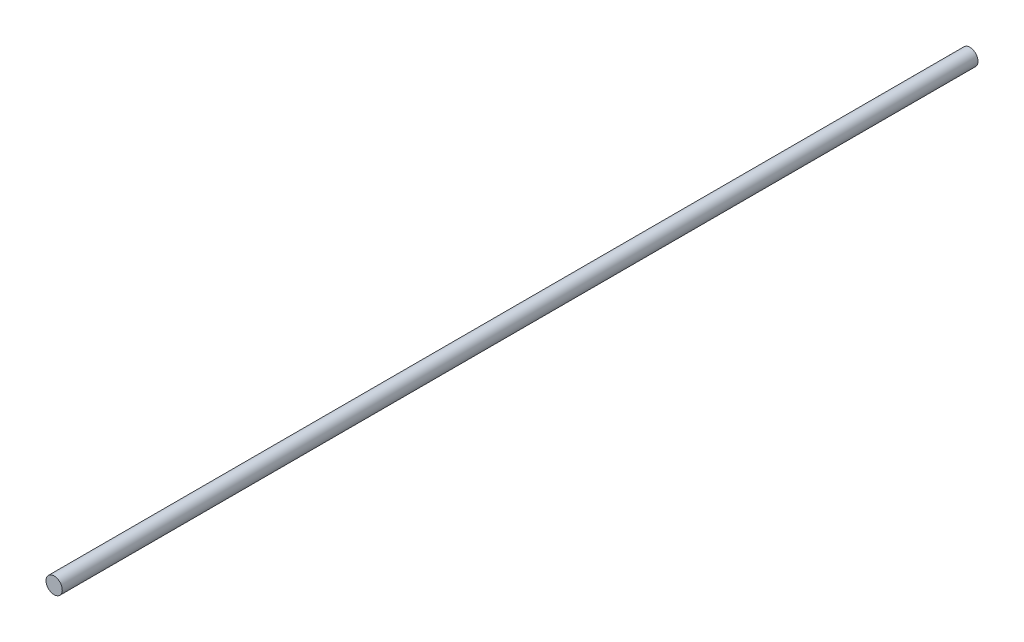
ISO-10303-21;
HEADER;
FILE_DESCRIPTION(('STEP AP214'),'2;1');
FILE_NAME('part.step','',(''),(''),'','','');
FILE_SCHEMA(('AUTOMOTIVE_DESIGN { 1 0 10303 214 1 1 1 1 }'));
ENDSEC;
DATA;
#1=APPLICATION_CONTEXT('core data for automotive mechanical design processes');
#2=APPLICATION_PROTOCOL_DEFINITION('international standard','automotive_design',2000,#1);
#3=PRODUCT_CONTEXT('',#1,'mechanical');
#4=PRODUCT('Part','Part','',(#3));
#5=PRODUCT_RELATED_PRODUCT_CATEGORY('part','',(#4));
#6=PRODUCT_DEFINITION_FORMATION('','',#4);
#7=PRODUCT_DEFINITION_CONTEXT('part definition',#1,'design');
#8=PRODUCT_DEFINITION('design','',#6,#7);
#9=PRODUCT_DEFINITION_SHAPE('','',#8);
#10=(LENGTH_UNIT() NAMED_UNIT(*) SI_UNIT(.MILLI.,.METRE.));
#11=(NAMED_UNIT(*) PLANE_ANGLE_UNIT() SI_UNIT($,.RADIAN.));
#12=(NAMED_UNIT(*) SI_UNIT($,.STERADIAN.) SOLID_ANGLE_UNIT());
#13=UNCERTAINTY_MEASURE_WITH_UNIT(LENGTH_MEASURE(1.E-05),#10,'distance_accuracy_value','');
#14=(GEOMETRIC_REPRESENTATION_CONTEXT(3) GLOBAL_UNCERTAINTY_ASSIGNED_CONTEXT((#13)) GLOBAL_UNIT_ASSIGNED_CONTEXT((#10,
#11,#12)) REPRESENTATION_CONTEXT('',''));
#15=CARTESIAN_POINT('',(0.,0.,0.));
#16=DIRECTION('',(0.,0.,1.));
#17=DIRECTION('',(1.,0.,0.));
#18=AXIS2_PLACEMENT_3D('',#15,#16,#17);
#19=CARTESIAN_POINT('',(0.,0.,450.));
#20=DIRECTION('',(0.,0.,-1.));
#21=DIRECTION('',(-1.,0.,0.));
#22=AXIS2_PLACEMENT_3D('',#19,#20,#21);
#23=CYLINDRICAL_SURFACE('',#22,4.);
#24=CARTESIAN_POINT('',(0.,0.,450.));
#25=DIRECTION('',(0.,0.,1.));
#26=DIRECTION('',(1.,0.,0.));
#27=AXIS2_PLACEMENT_3D('',#24,#25,#26);
#28=CIRCLE('',#27,4.);
#29=CARTESIAN_POINT('',(4.,0.,450.));
#30=VERTEX_POINT('',#29);
#31=EDGE_CURVE('E10',#30,#30,#28,.T.);
#32=ORIENTED_EDGE('',*,*,#31,.F.);
#33=EDGE_LOOP('',(#32));
#34=FACE_BOUND('',#33,.T.);
#35=CARTESIAN_POINT('',(0.,0.,0.));
#36=DIRECTION('',(0.,0.,1.));
#37=DIRECTION('',(1.,0.,0.));
#38=AXIS2_PLACEMENT_3D('',#35,#36,#37);
#39=CIRCLE('',#38,4.);
#40=CARTESIAN_POINT('',(4.,0.,0.));
#41=VERTEX_POINT('',#40);
#42=EDGE_CURVE('E40',#41,#41,#39,.T.);
#43=ORIENTED_EDGE('',*,*,#42,.T.);
#44=EDGE_LOOP('',(#43));
#45=FACE_BOUND('',#44,.T.);
#46=ADVANCED_FACE('F37',(#34,#45),#23,.T.);
#47=CARTESIAN_POINT('',(0.,0.,450.));
#48=DIRECTION('',(0.,0.,1.));
#49=DIRECTION('',(1.,0.,0.));
#50=AXIS2_PLACEMENT_3D('',#47,#48,#49);
#51=PLANE('',#50);
#52=ORIENTED_EDGE('',*,*,#31,.T.);
#53=EDGE_LOOP('',(#52));
#54=FACE_BOUND('',#53,.T.);
#55=ADVANCED_FACE('F52',(#54),#51,.T.);
#56=CARTESIAN_POINT('',(0.,0.,0.));
#57=DIRECTION('',(0.,0.,1.));
#58=DIRECTION('',(1.,0.,0.));
#59=AXIS2_PLACEMENT_3D('',#56,#57,#58);
#60=PLANE('',#59);
#61=ORIENTED_EDGE('',*,*,#42,.F.);
#62=EDGE_LOOP('',(#61));
#63=FACE_BOUND('',#62,.T.);
#64=ADVANCED_FACE('F50',(#63),#60,.F.);
#65=CLOSED_SHELL('',(#46,#55,#64));
#66=MANIFOLD_SOLID_BREP('B2',#65);
#67=ADVANCED_BREP_SHAPE_REPRESENTATION('',(#18,#66),#14);
#68=SHAPE_DEFINITION_REPRESENTATION(#9,#67);
ENDSEC;
END-ISO-10303-21;
